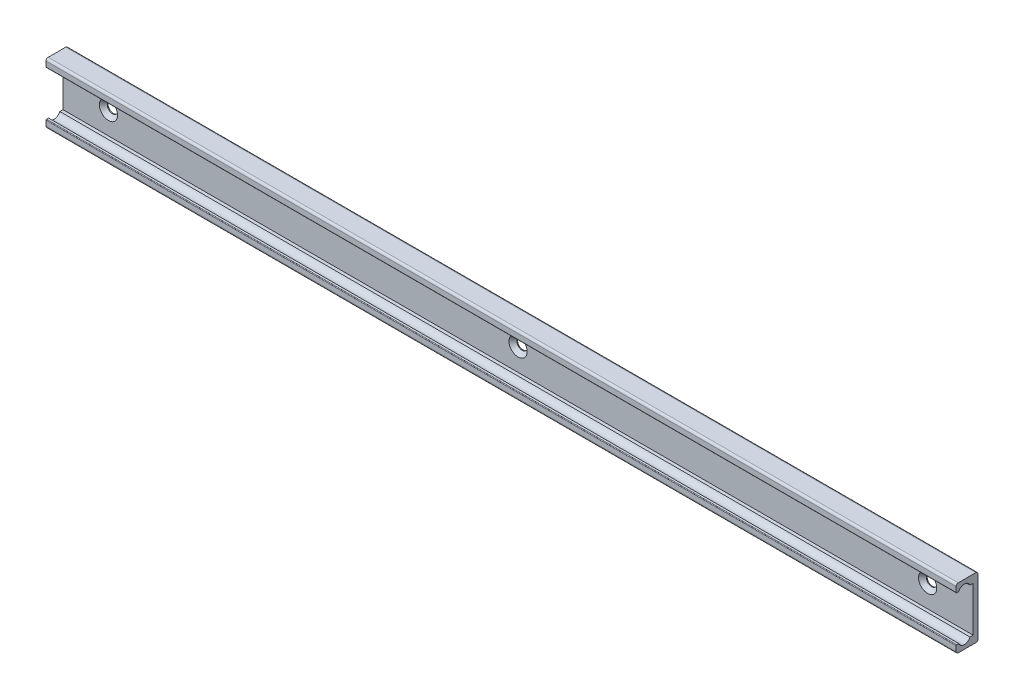
ISO-10303-21;
HEADER;
FILE_DESCRIPTION(('STEP AP214'),'2;1');
FILE_NAME('part.step','',(''),(''),'','','');
FILE_SCHEMA(('AUTOMOTIVE_DESIGN { 1 0 10303 214 1 1 1 1 }'));
ENDSEC;
DATA;
#1=APPLICATION_CONTEXT('core data for automotive mechanical design processes');
#2=APPLICATION_PROTOCOL_DEFINITION('international standard','automotive_design',2000,#1);
#3=PRODUCT_CONTEXT('',#1,'mechanical');
#4=PRODUCT('Part','Part','',(#3));
#5=PRODUCT_RELATED_PRODUCT_CATEGORY('part','',(#4));
#6=PRODUCT_DEFINITION_FORMATION('','',#4);
#7=PRODUCT_DEFINITION_CONTEXT('part definition',#1,'design');
#8=PRODUCT_DEFINITION('design','',#6,#7);
#9=PRODUCT_DEFINITION_SHAPE('','',#8);
#10=(LENGTH_UNIT() NAMED_UNIT(*) SI_UNIT(.MILLI.,.METRE.));
#11=(NAMED_UNIT(*) PLANE_ANGLE_UNIT() SI_UNIT($,.RADIAN.));
#12=(NAMED_UNIT(*) SI_UNIT($,.STERADIAN.) SOLID_ANGLE_UNIT());
#13=UNCERTAINTY_MEASURE_WITH_UNIT(LENGTH_MEASURE(1.E-05),#10,'distance_accuracy_value','');
#14=(GEOMETRIC_REPRESENTATION_CONTEXT(3) GLOBAL_UNCERTAINTY_ASSIGNED_CONTEXT((#13)) GLOBAL_UNIT_ASSIGNED_CONTEXT((#10,
#11,#12)) REPRESENTATION_CONTEXT('',''));
#15=CARTESIAN_POINT('',(0.,0.,0.));
#16=DIRECTION('',(0.,0.,1.));
#17=DIRECTION('',(1.,0.,0.));
#18=AXIS2_PLACEMENT_3D('',#15,#16,#17);
#19=CARTESIAN_POINT('',(285.,9.3,6.49999999999987));
#20=DIRECTION('',(-1.,0.,0.));
#21=DIRECTION('',(0.,0.,1.));
#22=AXIS2_PLACEMENT_3D('',#19,#20,#21);
#23=CYLINDRICAL_SURFACE('',#22,0.7);
#24=CARTESIAN_POINT('',(-15.,9.3,6.49999999999987));
#25=DIRECTION('',(-1.,0.,0.));
#26=DIRECTION('',(0.,0.,-1.));
#27=AXIS2_PLACEMENT_3D('',#24,#25,#26);
#28=CIRCLE('',#27,0.7);
#29=CARTESIAN_POINT('',(-15.,9.3,7.19999999999987));
#30=VERTEX_POINT('',#29);
#31=CARTESIAN_POINT('',(-15.,10.,6.49999999999987));
#32=VERTEX_POINT('',#31);
#33=EDGE_CURVE('E141',#30,#32,#28,.T.);
#34=ORIENTED_EDGE('',*,*,#33,.F.);
#35=DIRECTION('',(-1.,0.,0.));
#36=VECTOR('',#35,1.);
#37=CARTESIAN_POINT('',(285.,9.3,7.19999999999987));
#38=LINE('',#37,#36);
#39=CARTESIAN_POINT('',(285.,9.3,7.19999999999987));
#40=VERTEX_POINT('',#39);
#41=EDGE_CURVE('E11',#40,#30,#38,.T.);
#42=ORIENTED_EDGE('',*,*,#41,.F.);
#43=CARTESIAN_POINT('',(285.,9.3,6.49999999999987));
#44=DIRECTION('',(-1.,0.,0.));
#45=DIRECTION('',(0.,0.,-1.));
#46=AXIS2_PLACEMENT_3D('',#43,#44,#45);
#47=CIRCLE('',#46,0.7);
#48=CARTESIAN_POINT('',(285.,10.,6.49999999999987));
#49=VERTEX_POINT('',#48);
#50=EDGE_CURVE('E143',#40,#49,#47,.T.);
#51=ORIENTED_EDGE('',*,*,#50,.T.);
#52=DIRECTION('',(-1.,0.,0.));
#53=VECTOR('',#52,1.);
#54=CARTESIAN_POINT('',(285.,10.,6.49999999999987));
#55=LINE('',#54,#53);
#56=EDGE_CURVE('E138',#49,#32,#55,.T.);
#57=ORIENTED_EDGE('',*,*,#56,.T.);
#58=EDGE_LOOP('',(#34,#42,#51,#57));
#59=FACE_BOUND('',#58,.T.);
#60=ADVANCED_FACE('F16',(#59),#23,.T.);
#61=CARTESIAN_POINT('',(285.,7.60000008647907,7.19999999999987));
#62=DIRECTION('',(0.,0.,1.));
#63=DIRECTION('',(1.,0.,0.));
#64=AXIS2_PLACEMENT_3D('',#61,#62,#63);
#65=PLANE('',#64);
#66=DIRECTION('',(0.,1.,0.));
#67=VECTOR('',#66,1.);
#68=CARTESIAN_POINT('',(-15.,7.60000008647907,7.19999999999987));
#69=LINE('',#68,#67);
#70=CARTESIAN_POINT('',(-15.,7.60000008647907,7.19999999999987));
#71=VERTEX_POINT('',#70);
#72=EDGE_CURVE('E160',#71,#30,#69,.T.);
#73=ORIENTED_EDGE('',*,*,#72,.F.);
#74=DIRECTION('',(-1.,0.,0.));
#75=VECTOR('',#74,1.);
#76=CARTESIAN_POINT('',(285.,7.60000008647907,7.19999999999987));
#77=LINE('',#76,#75);
#78=CARTESIAN_POINT('',(285.,7.60000008647907,7.19999999999987));
#79=VERTEX_POINT('',#78);
#80=EDGE_CURVE('E24',#79,#71,#77,.T.);
#81=ORIENTED_EDGE('',*,*,#80,.F.);
#82=DIRECTION('',(0.,1.,0.));
#83=VECTOR('',#82,1.);
#84=CARTESIAN_POINT('',(285.,7.60000008647907,7.19999999999987));
#85=LINE('',#84,#83);
#86=EDGE_CURVE('E148',#79,#40,#85,.T.);
#87=ORIENTED_EDGE('',*,*,#86,.T.);
#88=ORIENTED_EDGE('',*,*,#41,.T.);
#89=EDGE_LOOP('',(#73,#81,#87,#88));
#90=FACE_BOUND('',#89,.T.);
#91=ADVANCED_FACE('F387',(#90),#65,.T.);
#92=CARTESIAN_POINT('',(285.,7.60000008647906,6.99999999999987));
#93=DIRECTION('',(-1.,0.,0.));
#94=DIRECTION('',(0.,0.,1.));
#95=AXIS2_PLACEMENT_3D('',#92,#93,#94);
#96=CYLINDRICAL_SURFACE('',#95,0.2);
#97=CARTESIAN_POINT('',(-15.,7.60000008647906,6.99999999999987));
#98=DIRECTION('',(-1.,0.,0.));
#99=DIRECTION('',(0.,0.,-1.));
#100=AXIS2_PLACEMENT_3D('',#97,#98,#99);
#101=CIRCLE('',#100,0.2);
#102=CARTESIAN_POINT('',(-15.,7.40000008647906,6.99999999999987));
#103=VERTEX_POINT('',#102);
#104=EDGE_CURVE('E208',#103,#71,#101,.T.);
#105=ORIENTED_EDGE('',*,*,#104,.F.);
#106=DIRECTION('',(-1.,0.,0.));
#107=VECTOR('',#106,1.);
#108=CARTESIAN_POINT('',(285.,7.40000008647906,6.99999999999987));
#109=LINE('',#108,#107);
#110=CARTESIAN_POINT('',(285.,7.40000008647906,6.99999999999987));
#111=VERTEX_POINT('',#110);
#112=EDGE_CURVE('E260',#111,#103,#109,.T.);
#113=ORIENTED_EDGE('',*,*,#112,.F.);
#114=CARTESIAN_POINT('',(285.,7.60000008647906,6.99999999999987));
#115=DIRECTION('',(-1.,0.,0.));
#116=DIRECTION('',(0.,0.,-1.));
#117=AXIS2_PLACEMENT_3D('',#114,#115,#116);
#118=CIRCLE('',#117,0.2);
#119=EDGE_CURVE('E256',#111,#79,#118,.T.);
#120=ORIENTED_EDGE('',*,*,#119,.T.);
#121=ORIENTED_EDGE('',*,*,#80,.T.);
#122=EDGE_LOOP('',(#105,#113,#120,#121));
#123=FACE_BOUND('',#122,.T.);
#124=ADVANCED_FACE('F391',(#123),#96,.T.);
#125=CARTESIAN_POINT('',(285.,7.40000008647906,6.35404949999996));
#126=DIRECTION('',(0.,-1.,0.));
#127=DIRECTION('',(1.,0.,0.));
#128=AXIS2_PLACEMENT_3D('',#125,#126,#127);
#129=PLANE('',#128);
#130=DIRECTION('',(0.,0.,1.));
#131=VECTOR('',#130,1.);
#132=CARTESIAN_POINT('',(-15.,7.40000008647906,6.35404949999996));
#133=LINE('',#132,#131);
#134=CARTESIAN_POINT('',(-15.,7.40000008647906,6.35404949999996));
#135=VERTEX_POINT('',#134);
#136=EDGE_CURVE('E205',#135,#103,#133,.T.);
#137=ORIENTED_EDGE('',*,*,#136,.F.);
#138=DIRECTION('',(-1.,0.,0.));
#139=VECTOR('',#138,1.);
#140=CARTESIAN_POINT('',(285.,7.40000008647906,6.35404949999996));
#141=LINE('',#140,#139);
#142=CARTESIAN_POINT('',(285.,7.40000008647906,6.35404949999996));
#143=VERTEX_POINT('',#142);
#144=EDGE_CURVE('E262',#143,#135,#141,.T.);
#145=ORIENTED_EDGE('',*,*,#144,.F.);
#146=DIRECTION('',(0.,0.,1.));
#147=VECTOR('',#146,1.);
#148=CARTESIAN_POINT('',(285.,7.40000008647906,6.35404949999996));
#149=LINE('',#148,#147);
#150=EDGE_CURVE('E253',#143,#111,#149,.T.);
#151=ORIENTED_EDGE('',*,*,#150,.T.);
#152=ORIENTED_EDGE('',*,*,#112,.T.);
#153=EDGE_LOOP('',(#137,#145,#151,#152));
#154=FACE_BOUND('',#153,.T.);
#155=ADVANCED_FACE('F396',(#154),#129,.T.);
#156=CARTESIAN_POINT('',(285.,6.65000008647909,4.50000000000006));
#157=DIRECTION('',(-1.,0.,0.));
#158=DIRECTION('',(0.,0.,1.));
#159=AXIS2_PLACEMENT_3D('',#156,#157,#158);
#160=CYLINDRICAL_SURFACE('',#159,1.99999988711246);
#161=CARTESIAN_POINT('',(-15.,6.65000008647909,4.50000000000006));
#162=DIRECTION('',(1.,0.,0.));
#163=DIRECTION('',(0.,0.,1.));
#164=AXIS2_PLACEMENT_3D('',#161,#162,#163);
#165=CIRCLE('',#164,1.99999988711246);
#166=CARTESIAN_POINT('',(-15.,7.40000008647906,2.64595050000016));
#167=VERTEX_POINT('',#166);
#168=EDGE_CURVE('E202',#167,#135,#165,.T.);
#169=ORIENTED_EDGE('',*,*,#168,.F.);
#170=DIRECTION('',(-1.,0.,0.));
#171=VECTOR('',#170,1.);
#172=CARTESIAN_POINT('',(285.,7.40000008647906,2.64595050000016));
#173=LINE('',#172,#171);
#174=CARTESIAN_POINT('',(285.,7.40000008647906,2.64595050000016));
#175=VERTEX_POINT('',#174);
#176=EDGE_CURVE('E264',#175,#167,#173,.T.);
#177=ORIENTED_EDGE('',*,*,#176,.F.);
#178=CARTESIAN_POINT('',(285.,6.65000008647909,4.50000000000006));
#179=DIRECTION('',(1.,0.,0.));
#180=DIRECTION('',(0.,0.,1.));
#181=AXIS2_PLACEMENT_3D('',#178,#179,#180);
#182=CIRCLE('',#181,1.99999988711246);
#183=EDGE_CURVE('E250',#175,#143,#182,.T.);
#184=ORIENTED_EDGE('',*,*,#183,.T.);
#185=ORIENTED_EDGE('',*,*,#144,.T.);
#186=EDGE_LOOP('',(#169,#177,#184,#185));
#187=FACE_BOUND('',#186,.T.);
#188=ADVANCED_FACE('F404',(#187),#160,.F.);
#189=CARTESIAN_POINT('',(285.,7.40000008647906,1.60000000000016));
#190=DIRECTION('',(0.,-1.,0.));
#191=DIRECTION('',(1.,0.,0.));
#192=AXIS2_PLACEMENT_3D('',#189,#190,#191);
#193=PLANE('',#192);
#194=DIRECTION('',(0.,0.,1.));
#195=VECTOR('',#194,1.);
#196=CARTESIAN_POINT('',(-15.,7.40000008647906,1.60000000000015));
#197=LINE('',#196,#195);
#198=CARTESIAN_POINT('',(-15.,7.40000008647906,1.60000000000015));
#199=VERTEX_POINT('',#198);
#200=EDGE_CURVE('E199',#199,#167,#197,.T.);
#201=ORIENTED_EDGE('',*,*,#200,.F.);
#202=DIRECTION('',(-1.,0.,0.));
#203=VECTOR('',#202,1.);
#204=CARTESIAN_POINT('',(285.,7.40000008647906,1.60000000000016));
#205=LINE('',#204,#203);
#206=CARTESIAN_POINT('',(285.,7.40000008647906,1.60000000000016));
#207=VERTEX_POINT('',#206);
#208=EDGE_CURVE('E266',#207,#199,#205,.T.);
#209=ORIENTED_EDGE('',*,*,#208,.F.);
#210=DIRECTION('',(0.,0.,1.));
#211=VECTOR('',#210,1.);
#212=CARTESIAN_POINT('',(285.,7.40000008647906,1.60000000000016));
#213=LINE('',#212,#211);
#214=EDGE_CURVE('E247',#207,#175,#213,.T.);
#215=ORIENTED_EDGE('',*,*,#214,.T.);
#216=ORIENTED_EDGE('',*,*,#176,.T.);
#217=EDGE_LOOP('',(#201,#209,#215,#216));
#218=FACE_BOUND('',#217,.T.);
#219=ADVANCED_FACE('F332',(#218),#193,.T.);
#220=CARTESIAN_POINT('',(285.,-7.40000008647906,1.60000000000016));
#221=DIRECTION('',(0.,0.,1.));
#222=DIRECTION('',(0.,1.,0.));
#223=AXIS2_PLACEMENT_3D('',#220,#221,#222);
#224=PLANE('',#223);
#225=CARTESIAN_POINT('',(270.,0.,1.60000000000016));
#226=DIRECTION('',(0.,0.,1.));
#227=DIRECTION('',(0.,1.,0.));
#228=AXIS2_PLACEMENT_3D('',#225,#226,#227);
#229=CIRCLE('',#228,3.);
#230=CARTESIAN_POINT('',(270.,3.,1.60000000000016));
#231=VERTEX_POINT('',#230);
#232=EDGE_CURVE('E293',#231,#231,#229,.T.);
#233=ORIENTED_EDGE('',*,*,#232,.F.);
#234=EDGE_LOOP('',(#233));
#235=FACE_BOUND('',#234,.T.);
#236=CARTESIAN_POINT('',(135.,0.,1.60000000000016));
#237=DIRECTION('',(0.,0.,1.));
#238=DIRECTION('',(0.,1.,0.));
#239=AXIS2_PLACEMENT_3D('',#236,#237,#238);
#240=CIRCLE('',#239,3.);
#241=CARTESIAN_POINT('',(135.,3.,1.60000000000016));
#242=VERTEX_POINT('',#241);
#243=EDGE_CURVE('E298',#242,#242,#240,.T.);
#244=ORIENTED_EDGE('',*,*,#243,.F.);
#245=EDGE_LOOP('',(#244));
#246=FACE_BOUND('',#245,.T.);
#247=CARTESIAN_POINT('',(0.,0.,1.60000000000016));
#248=DIRECTION('',(0.,0.,1.));
#249=DIRECTION('',(0.,1.,0.));
#250=AXIS2_PLACEMENT_3D('',#247,#248,#249);
#251=CIRCLE('',#250,3.);
#252=CARTESIAN_POINT('',(0.,3.,1.60000000000016));
#253=VERTEX_POINT('',#252);
#254=EDGE_CURVE('E161',#253,#253,#251,.T.);
#255=ORIENTED_EDGE('',*,*,#254,.F.);
#256=EDGE_LOOP('',(#255));
#257=FACE_BOUND('',#256,.T.);
#258=DIRECTION('',(0.,1.,0.));
#259=VECTOR('',#258,1.);
#260=CARTESIAN_POINT('',(-15.,-7.40000008647906,1.60000000000016));
#261=LINE('',#260,#259);
#262=CARTESIAN_POINT('',(-15.,-7.40000008647906,1.60000000000016));
#263=VERTEX_POINT('',#262);
#264=EDGE_CURVE('E196',#263,#199,#261,.T.);
#265=ORIENTED_EDGE('',*,*,#264,.F.);
#266=DIRECTION('',(-1.,0.,0.));
#267=VECTOR('',#266,1.);
#268=CARTESIAN_POINT('',(285.,-7.40000008647906,1.60000000000016));
#269=LINE('',#268,#267);
#270=CARTESIAN_POINT('',(285.,-7.40000008647906,1.60000000000016));
#271=VERTEX_POINT('',#270);
#272=EDGE_CURVE('E268',#271,#263,#269,.T.);
#273=ORIENTED_EDGE('',*,*,#272,.F.);
#274=DIRECTION('',(0.,1.,0.));
#275=VECTOR('',#274,1.);
#276=CARTESIAN_POINT('',(285.,-7.40000008647906,1.60000000000016));
#277=LINE('',#276,#275);
#278=EDGE_CURVE('E244',#271,#207,#277,.T.);
#279=ORIENTED_EDGE('',*,*,#278,.T.);
#280=ORIENTED_EDGE('',*,*,#208,.T.);
#281=EDGE_LOOP('',(#265,#273,#279,#280));
#282=FACE_BOUND('',#281,.T.);
#283=ADVANCED_FACE('F328',(#235,#246,#257,#282),#224,.T.);
#284=CARTESIAN_POINT('',(285.,-7.40000008647906,1.60000000000016));
#285=DIRECTION('',(0.,1.,0.));
#286=DIRECTION('',(-1.,0.,0.));
#287=AXIS2_PLACEMENT_3D('',#284,#285,#286);
#288=PLANE('',#287);
#289=DIRECTION('',(0.,0.,-1.));
#290=VECTOR('',#289,1.);
#291=CARTESIAN_POINT('',(-15.,-7.40000008647906,1.60000000000016));
#292=LINE('',#291,#290);
#293=CARTESIAN_POINT('',(-15.,-7.40000008647907,2.64595050000016));
#294=VERTEX_POINT('',#293);
#295=EDGE_CURVE('E193',#294,#263,#292,.T.);
#296=ORIENTED_EDGE('',*,*,#295,.F.);
#297=DIRECTION('',(-1.,0.,0.));
#298=VECTOR('',#297,1.);
#299=CARTESIAN_POINT('',(285.,-7.40000008647907,2.64595050000016));
#300=LINE('',#299,#298);
#301=CARTESIAN_POINT('',(285.,-7.40000008647907,2.64595050000016));
#302=VERTEX_POINT('',#301);
#303=EDGE_CURVE('E270',#302,#294,#300,.T.);
#304=ORIENTED_EDGE('',*,*,#303,.F.);
#305=DIRECTION('',(0.,0.,-1.));
#306=VECTOR('',#305,1.);
#307=CARTESIAN_POINT('',(285.,-7.40000008647906,1.60000000000016));
#308=LINE('',#307,#306);
#309=EDGE_CURVE('E241',#302,#271,#308,.T.);
#310=ORIENTED_EDGE('',*,*,#309,.T.);
#311=ORIENTED_EDGE('',*,*,#272,.T.);
#312=EDGE_LOOP('',(#296,#304,#310,#311));
#313=FACE_BOUND('',#312,.T.);
#314=ADVANCED_FACE('F331',(#313),#288,.T.);
#315=CARTESIAN_POINT('',(285.,-6.65000008647909,4.50000000000006));
#316=DIRECTION('',(-1.,0.,0.));
#317=DIRECTION('',(0.,0.,1.));
#318=AXIS2_PLACEMENT_3D('',#315,#316,#317);
#319=CYLINDRICAL_SURFACE('',#318,1.99999988711246);
#320=CARTESIAN_POINT('',(-15.,-6.65000008647909,4.50000000000006));
#321=DIRECTION('',(1.,0.,0.));
#322=DIRECTION('',(0.,0.,-1.));
#323=AXIS2_PLACEMENT_3D('',#320,#321,#322);
#324=CIRCLE('',#323,1.99999988711246);
#325=CARTESIAN_POINT('',(-15.,-7.40000008647906,6.35404949999996));
#326=VERTEX_POINT('',#325);
#327=EDGE_CURVE('E190',#326,#294,#324,.T.);
#328=ORIENTED_EDGE('',*,*,#327,.F.);
#329=DIRECTION('',(-1.,0.,0.));
#330=VECTOR('',#329,1.);
#331=CARTESIAN_POINT('',(285.,-7.40000008647906,6.35404949999996));
#332=LINE('',#331,#330);
#333=CARTESIAN_POINT('',(285.,-7.40000008647906,6.35404949999996));
#334=VERTEX_POINT('',#333);
#335=EDGE_CURVE('E272',#334,#326,#332,.T.);
#336=ORIENTED_EDGE('',*,*,#335,.F.);
#337=CARTESIAN_POINT('',(285.,-6.65000008647909,4.50000000000006));
#338=DIRECTION('',(1.,0.,0.));
#339=DIRECTION('',(0.,0.,-1.));
#340=AXIS2_PLACEMENT_3D('',#337,#338,#339);
#341=CIRCLE('',#340,1.99999988711246);
#342=EDGE_CURVE('E238',#334,#302,#341,.T.);
#343=ORIENTED_EDGE('',*,*,#342,.T.);
#344=ORIENTED_EDGE('',*,*,#303,.T.);
#345=EDGE_LOOP('',(#328,#336,#343,#344));
#346=FACE_BOUND('',#345,.T.);
#347=ADVANCED_FACE('F348',(#346),#319,.F.);
#348=CARTESIAN_POINT('',(285.,-7.40000008647906,6.35404949999996));
#349=DIRECTION('',(0.,1.,0.));
#350=DIRECTION('',(-1.,0.,0.));
#351=AXIS2_PLACEMENT_3D('',#348,#349,#350);
#352=PLANE('',#351);
#353=DIRECTION('',(0.,0.,-1.));
#354=VECTOR('',#353,1.);
#355=CARTESIAN_POINT('',(-15.,-7.40000008647906,6.35404949999996));
#356=LINE('',#355,#354);
#357=CARTESIAN_POINT('',(-15.,-7.40000008647906,6.99999999999987));
#358=VERTEX_POINT('',#357);
#359=EDGE_CURVE('E187',#358,#326,#356,.T.);
#360=ORIENTED_EDGE('',*,*,#359,.F.);
#361=DIRECTION('',(-1.,0.,0.));
#362=VECTOR('',#361,1.);
#363=CARTESIAN_POINT('',(285.,-7.40000008647906,6.99999999999987));
#364=LINE('',#363,#362);
#365=CARTESIAN_POINT('',(285.,-7.40000008647906,6.99999999999987));
#366=VERTEX_POINT('',#365);
#367=EDGE_CURVE('E274',#366,#358,#364,.T.);
#368=ORIENTED_EDGE('',*,*,#367,.F.);
#369=DIRECTION('',(0.,0.,-1.));
#370=VECTOR('',#369,1.);
#371=CARTESIAN_POINT('',(285.,-7.40000008647906,6.35404949999996));
#372=LINE('',#371,#370);
#373=EDGE_CURVE('E235',#366,#334,#372,.T.);
#374=ORIENTED_EDGE('',*,*,#373,.T.);
#375=ORIENTED_EDGE('',*,*,#335,.T.);
#376=EDGE_LOOP('',(#360,#368,#374,#375));
#377=FACE_BOUND('',#376,.T.);
#378=ADVANCED_FACE('F351',(#377),#352,.T.);
#379=CARTESIAN_POINT('',(285.,-7.60000008647906,6.99999999999987));
#380=DIRECTION('',(-1.,0.,0.));
#381=DIRECTION('',(0.,0.,1.));
#382=AXIS2_PLACEMENT_3D('',#379,#380,#381);
#383=CYLINDRICAL_SURFACE('',#382,0.2);
#384=CARTESIAN_POINT('',(-15.,-7.60000008647906,6.99999999999987));
#385=DIRECTION('',(-1.,0.,0.));
#386=DIRECTION('',(0.,0.,1.));
#387=AXIS2_PLACEMENT_3D('',#384,#385,#386);
#388=CIRCLE('',#387,0.2);
#389=CARTESIAN_POINT('',(-15.,-7.60000008647907,7.19999999999987));
#390=VERTEX_POINT('',#389);
#391=EDGE_CURVE('E184',#390,#358,#388,.T.);
#392=ORIENTED_EDGE('',*,*,#391,.F.);
#393=DIRECTION('',(-1.,0.,0.));
#394=VECTOR('',#393,1.);
#395=CARTESIAN_POINT('',(285.,-7.60000008647907,7.19999999999987));
#396=LINE('',#395,#394);
#397=CARTESIAN_POINT('',(285.,-7.60000008647907,7.19999999999987));
#398=VERTEX_POINT('',#397);
#399=EDGE_CURVE('E276',#398,#390,#396,.T.);
#400=ORIENTED_EDGE('',*,*,#399,.F.);
#401=CARTESIAN_POINT('',(285.,-7.60000008647906,6.99999999999987));
#402=DIRECTION('',(-1.,0.,0.));
#403=DIRECTION('',(0.,0.,1.));
#404=AXIS2_PLACEMENT_3D('',#401,#402,#403);
#405=CIRCLE('',#404,0.2);
#406=EDGE_CURVE('E232',#398,#366,#405,.T.);
#407=ORIENTED_EDGE('',*,*,#406,.T.);
#408=ORIENTED_EDGE('',*,*,#367,.T.);
#409=EDGE_LOOP('',(#392,#400,#407,#408));
#410=FACE_BOUND('',#409,.T.);
#411=ADVANCED_FACE('F356',(#410),#383,.T.);
#412=CARTESIAN_POINT('',(285.,-7.60000008647907,7.19999999999987));
#413=DIRECTION('',(0.,0.,1.));
#414=DIRECTION('',(1.,0.,0.));
#415=AXIS2_PLACEMENT_3D('',#412,#413,#414);
#416=PLANE('',#415);
#417=DIRECTION('',(0.,1.,0.));
#418=VECTOR('',#417,1.);
#419=CARTESIAN_POINT('',(-15.,-7.60000008647907,7.19999999999987));
#420=LINE('',#419,#418);
#421=CARTESIAN_POINT('',(-15.,-9.3,7.19999999999987));
#422=VERTEX_POINT('',#421);
#423=EDGE_CURVE('E181',#422,#390,#420,.T.);
#424=ORIENTED_EDGE('',*,*,#423,.F.);
#425=DIRECTION('',(-1.,0.,0.));
#426=VECTOR('',#425,1.);
#427=CARTESIAN_POINT('',(285.,-9.3,7.19999999999987));
#428=LINE('',#427,#426);
#429=CARTESIAN_POINT('',(285.,-9.3,7.19999999999987));
#430=VERTEX_POINT('',#429);
#431=EDGE_CURVE('E278',#430,#422,#428,.T.);
#432=ORIENTED_EDGE('',*,*,#431,.F.);
#433=DIRECTION('',(0.,1.,0.));
#434=VECTOR('',#433,1.);
#435=CARTESIAN_POINT('',(285.,-7.60000008647907,7.19999999999987));
#436=LINE('',#435,#434);
#437=EDGE_CURVE('E229',#430,#398,#436,.T.);
#438=ORIENTED_EDGE('',*,*,#437,.T.);
#439=ORIENTED_EDGE('',*,*,#399,.T.);
#440=EDGE_LOOP('',(#424,#432,#438,#439));
#441=FACE_BOUND('',#440,.T.);
#442=ADVANCED_FACE('F359',(#441),#416,.T.);
#443=CARTESIAN_POINT('',(285.,-9.3,6.49999999999987));
#444=DIRECTION('',(-1.,0.,0.));
#445=DIRECTION('',(0.,0.,1.));
#446=AXIS2_PLACEMENT_3D('',#443,#444,#445);
#447=CYLINDRICAL_SURFACE('',#446,0.7);
#448=CARTESIAN_POINT('',(-15.,-9.3,6.49999999999987));
#449=DIRECTION('',(-1.,0.,0.));
#450=DIRECTION('',(0.,0.,1.));
#451=AXIS2_PLACEMENT_3D('',#448,#449,#450);
#452=CIRCLE('',#451,0.7);
#453=CARTESIAN_POINT('',(-15.,-10.,6.49999999999987));
#454=VERTEX_POINT('',#453);
#455=EDGE_CURVE('E178',#454,#422,#452,.T.);
#456=ORIENTED_EDGE('',*,*,#455,.F.);
#457=DIRECTION('',(-1.,0.,0.));
#458=VECTOR('',#457,1.);
#459=CARTESIAN_POINT('',(285.,-10.,6.49999999999987));
#460=LINE('',#459,#458);
#461=CARTESIAN_POINT('',(285.,-10.,6.49999999999987));
#462=VERTEX_POINT('',#461);
#463=EDGE_CURVE('E280',#462,#454,#460,.T.);
#464=ORIENTED_EDGE('',*,*,#463,.F.);
#465=CARTESIAN_POINT('',(285.,-9.3,6.49999999999987));
#466=DIRECTION('',(-1.,0.,0.));
#467=DIRECTION('',(0.,0.,1.));
#468=AXIS2_PLACEMENT_3D('',#465,#466,#467);
#469=CIRCLE('',#468,0.7);
#470=EDGE_CURVE('E226',#462,#430,#469,.T.);
#471=ORIENTED_EDGE('',*,*,#470,.T.);
#472=ORIENTED_EDGE('',*,*,#431,.T.);
#473=EDGE_LOOP('',(#456,#464,#471,#472));
#474=FACE_BOUND('',#473,.T.);
#475=ADVANCED_FACE('F364',(#474),#447,.T.);
#476=CARTESIAN_POINT('',(285.,-10.,0.700000000000001));
#477=DIRECTION('',(0.,-1.,0.));
#478=DIRECTION('',(1.,0.,0.));
#479=AXIS2_PLACEMENT_3D('',#476,#477,#478);
#480=PLANE('',#479);
#481=DIRECTION('',(0.,0.,1.));
#482=VECTOR('',#481,1.);
#483=CARTESIAN_POINT('',(-15.,-10.,0.700000000000001));
#484=LINE('',#483,#482);
#485=CARTESIAN_POINT('',(-15.,-10.,0.700000000000001));
#486=VERTEX_POINT('',#485);
#487=EDGE_CURVE('E175',#486,#454,#484,.T.);
#488=ORIENTED_EDGE('',*,*,#487,.F.);
#489=DIRECTION('',(-1.,0.,0.));
#490=VECTOR('',#489,1.);
#491=CARTESIAN_POINT('',(285.,-10.,0.700000000000001));
#492=LINE('',#491,#490);
#493=CARTESIAN_POINT('',(285.,-10.,0.700000000000001));
#494=VERTEX_POINT('',#493);
#495=EDGE_CURVE('E282',#494,#486,#492,.T.);
#496=ORIENTED_EDGE('',*,*,#495,.F.);
#497=DIRECTION('',(0.,0.,1.));
#498=VECTOR('',#497,1.);
#499=CARTESIAN_POINT('',(285.,-10.,0.700000000000001));
#500=LINE('',#499,#498);
#501=EDGE_CURVE('E223',#494,#462,#500,.T.);
#502=ORIENTED_EDGE('',*,*,#501,.T.);
#503=ORIENTED_EDGE('',*,*,#463,.T.);
#504=EDGE_LOOP('',(#488,#496,#502,#503));
#505=FACE_BOUND('',#504,.T.);
#506=ADVANCED_FACE('F367',(#505),#480,.T.);
#507=CARTESIAN_POINT('',(285.,-9.3,0.700000000000001));
#508=DIRECTION('',(-1.,0.,0.));
#509=DIRECTION('',(0.,0.,1.));
#510=AXIS2_PLACEMENT_3D('',#507,#508,#509);
#511=CYLINDRICAL_SURFACE('',#510,0.7);
#512=CARTESIAN_POINT('',(-15.,-9.3,0.700000000000001));
#513=DIRECTION('',(-1.,0.,0.));
#514=DIRECTION('',(0.,0.,1.));
#515=AXIS2_PLACEMENT_3D('',#512,#513,#514);
#516=CIRCLE('',#515,0.7);
#517=CARTESIAN_POINT('',(-15.,-9.3,0.));
#518=VERTEX_POINT('',#517);
#519=EDGE_CURVE('E172',#518,#486,#516,.T.);
#520=ORIENTED_EDGE('',*,*,#519,.F.);
#521=DIRECTION('',(-1.,0.,0.));
#522=VECTOR('',#521,1.);
#523=CARTESIAN_POINT('',(285.,-9.3,0.));
#524=LINE('',#523,#522);
#525=CARTESIAN_POINT('',(285.,-9.3,0.));
#526=VERTEX_POINT('',#525);
#527=EDGE_CURVE('E284',#526,#518,#524,.T.);
#528=ORIENTED_EDGE('',*,*,#527,.F.);
#529=CARTESIAN_POINT('',(285.,-9.3,0.700000000000001));
#530=DIRECTION('',(-1.,0.,0.));
#531=DIRECTION('',(0.,0.,1.));
#532=AXIS2_PLACEMENT_3D('',#529,#530,#531);
#533=CIRCLE('',#532,0.7);
#534=EDGE_CURVE('E220',#526,#494,#533,.T.);
#535=ORIENTED_EDGE('',*,*,#534,.T.);
#536=ORIENTED_EDGE('',*,*,#495,.T.);
#537=EDGE_LOOP('',(#520,#528,#535,#536));
#538=FACE_BOUND('',#537,.T.);
#539=ADVANCED_FACE('F372',(#538),#511,.T.);
#540=CARTESIAN_POINT('',(285.,-9.3,0.));
#541=DIRECTION('',(0.,0.,-1.));
#542=DIRECTION('',(-1.,0.,0.));
#543=AXIS2_PLACEMENT_3D('',#540,#541,#542);
#544=PLANE('',#543);
#545=CARTESIAN_POINT('',(270.,0.,0.));
#546=DIRECTION('',(0.,0.,1.));
#547=DIRECTION('',(0.,1.,0.));
#548=AXIS2_PLACEMENT_3D('',#545,#546,#547);
#549=CIRCLE('',#548,1.75);
#550=CARTESIAN_POINT('',(270.,1.75,0.));
#551=VERTEX_POINT('',#550);
#552=EDGE_CURVE('E305',#551,#551,#549,.T.);
#553=ORIENTED_EDGE('',*,*,#552,.T.);
#554=EDGE_LOOP('',(#553));
#555=FACE_BOUND('',#554,.T.);
#556=CARTESIAN_POINT('',(135.,0.,0.));
#557=DIRECTION('',(0.,0.,1.));
#558=DIRECTION('',(0.,1.,0.));
#559=AXIS2_PLACEMENT_3D('',#556,#557,#558);
#560=CIRCLE('',#559,1.75);
#561=CARTESIAN_POINT('',(135.,1.75,0.));
#562=VERTEX_POINT('',#561);
#563=EDGE_CURVE('E294',#562,#562,#560,.T.);
#564=ORIENTED_EDGE('',*,*,#563,.T.);
#565=EDGE_LOOP('',(#564));
#566=FACE_BOUND('',#565,.T.);
#567=CARTESIAN_POINT('',(0.,0.,0.));
#568=DIRECTION('',(0.,0.,1.));
#569=DIRECTION('',(0.,1.,0.));
#570=AXIS2_PLACEMENT_3D('',#567,#568,#569);
#571=CIRCLE('',#570,1.75);
#572=CARTESIAN_POINT('',(0.,1.75,0.));
#573=VERTEX_POINT('',#572);
#574=EDGE_CURVE('E290',#573,#573,#571,.T.);
#575=ORIENTED_EDGE('',*,*,#574,.T.);
#576=EDGE_LOOP('',(#575));
#577=FACE_BOUND('',#576,.T.);
#578=DIRECTION('',(0.,-1.,0.));
#579=VECTOR('',#578,1.);
#580=CARTESIAN_POINT('',(-15.,-9.3,0.));
#581=LINE('',#580,#579);
#582=CARTESIAN_POINT('',(-15.,9.3,0.));
#583=VERTEX_POINT('',#582);
#584=EDGE_CURVE('E169',#583,#518,#581,.T.);
#585=ORIENTED_EDGE('',*,*,#584,.F.);
#586=DIRECTION('',(-1.,0.,0.));
#587=VECTOR('',#586,1.);
#588=CARTESIAN_POINT('',(285.,9.3,0.));
#589=LINE('',#588,#587);
#590=CARTESIAN_POINT('',(285.,9.3,0.));
#591=VERTEX_POINT('',#590);
#592=EDGE_CURVE('E286',#591,#583,#589,.T.);
#593=ORIENTED_EDGE('',*,*,#592,.F.);
#594=DIRECTION('',(0.,-1.,0.));
#595=VECTOR('',#594,1.);
#596=CARTESIAN_POINT('',(285.,-9.3,0.));
#597=LINE('',#596,#595);
#598=EDGE_CURVE('E217',#591,#526,#597,.T.);
#599=ORIENTED_EDGE('',*,*,#598,.T.);
#600=ORIENTED_EDGE('',*,*,#527,.T.);
#601=EDGE_LOOP('',(#585,#593,#599,#600));
#602=FACE_BOUND('',#601,.T.);
#603=ADVANCED_FACE('F312',(#555,#566,#577,#602),#544,.T.);
#604=CARTESIAN_POINT('',(285.,9.3,0.699999999999999));
#605=DIRECTION('',(-1.,0.,0.));
#606=DIRECTION('',(0.,0.,1.));
#607=AXIS2_PLACEMENT_3D('',#604,#605,#606);
#608=CYLINDRICAL_SURFACE('',#607,0.7);
#609=CARTESIAN_POINT('',(-15.,9.3,0.699999999999999));
#610=DIRECTION('',(-1.,0.,0.));
#611=DIRECTION('',(0.,0.,-1.));
#612=AXIS2_PLACEMENT_3D('',#609,#610,#611);
#613=CIRCLE('',#612,0.7);
#614=CARTESIAN_POINT('',(-15.,10.,0.699999999999999));
#615=VERTEX_POINT('',#614);
#616=EDGE_CURVE('E156',#615,#583,#613,.T.);
#617=ORIENTED_EDGE('',*,*,#616,.F.);
#618=DIRECTION('',(-1.,0.,0.));
#619=VECTOR('',#618,1.);
#620=CARTESIAN_POINT('',(285.,10.,0.699999999999999));
#621=LINE('',#620,#619);
#622=CARTESIAN_POINT('',(285.,10.,0.699999999999999));
#623=VERTEX_POINT('',#622);
#624=EDGE_CURVE('E147',#623,#615,#621,.T.);
#625=ORIENTED_EDGE('',*,*,#624,.F.);
#626=CARTESIAN_POINT('',(285.,9.3,0.699999999999999));
#627=DIRECTION('',(-1.,0.,0.));
#628=DIRECTION('',(0.,0.,-1.));
#629=AXIS2_PLACEMENT_3D('',#626,#627,#628);
#630=CIRCLE('',#629,0.7);
#631=EDGE_CURVE('E214',#623,#591,#630,.T.);
#632=ORIENTED_EDGE('',*,*,#631,.T.);
#633=ORIENTED_EDGE('',*,*,#592,.T.);
#634=EDGE_LOOP('',(#617,#625,#632,#633));
#635=FACE_BOUND('',#634,.T.);
#636=ADVANCED_FACE('F376',(#635),#608,.T.);
#637=CARTESIAN_POINT('',(285.,10.,0.699999999999999));
#638=DIRECTION('',(0.,1.,0.));
#639=DIRECTION('',(-1.,0.,0.));
#640=AXIS2_PLACEMENT_3D('',#637,#638,#639);
#641=PLANE('',#640);
#642=DIRECTION('',(0.,0.,-1.));
#643=VECTOR('',#642,1.);
#644=CARTESIAN_POINT('',(-15.,10.,0.699999999999999));
#645=LINE('',#644,#643);
#646=EDGE_CURVE('E151',#32,#615,#645,.T.);
#647=ORIENTED_EDGE('',*,*,#646,.F.);
#648=ORIENTED_EDGE('',*,*,#56,.F.);
#649=DIRECTION('',(0.,0.,-1.));
#650=VECTOR('',#649,1.);
#651=CARTESIAN_POINT('',(285.,10.,0.699999999999999));
#652=LINE('',#651,#650);
#653=EDGE_CURVE('E212',#49,#623,#652,.T.);
#654=ORIENTED_EDGE('',*,*,#653,.T.);
#655=ORIENTED_EDGE('',*,*,#624,.T.);
#656=EDGE_LOOP('',(#647,#648,#654,#655));
#657=FACE_BOUND('',#656,.T.);
#658=ADVANCED_FACE('F152',(#657),#641,.T.);
#659=CARTESIAN_POINT('',(285.,9.3,6.49999999999987));
#660=DIRECTION('',(1.,0.,0.));
#661=DIRECTION('',(0.,0.,-1.));
#662=AXIS2_PLACEMENT_3D('',#659,#660,#661);
#663=PLANE('',#662);
#664=ORIENTED_EDGE('',*,*,#50,.F.);
#665=ORIENTED_EDGE('',*,*,#86,.F.);
#666=ORIENTED_EDGE('',*,*,#119,.F.);
#667=ORIENTED_EDGE('',*,*,#150,.F.);
#668=ORIENTED_EDGE('',*,*,#183,.F.);
#669=ORIENTED_EDGE('',*,*,#214,.F.);
#670=ORIENTED_EDGE('',*,*,#278,.F.);
#671=ORIENTED_EDGE('',*,*,#309,.F.);
#672=ORIENTED_EDGE('',*,*,#342,.F.);
#673=ORIENTED_EDGE('',*,*,#373,.F.);
#674=ORIENTED_EDGE('',*,*,#406,.F.);
#675=ORIENTED_EDGE('',*,*,#437,.F.);
#676=ORIENTED_EDGE('',*,*,#470,.F.);
#677=ORIENTED_EDGE('',*,*,#501,.F.);
#678=ORIENTED_EDGE('',*,*,#534,.F.);
#679=ORIENTED_EDGE('',*,*,#598,.F.);
#680=ORIENTED_EDGE('',*,*,#631,.F.);
#681=ORIENTED_EDGE('',*,*,#653,.F.);
#682=EDGE_LOOP('',(#664,#665,#666,#667,#668,#669,#670,#671,#672,#673,#674,#675,#676,#677,#678,
#679,#680,#681));
#683=FACE_BOUND('',#682,.T.);
#684=ADVANCED_FACE('F344',(#683),#663,.T.);
#685=CARTESIAN_POINT('',(-15.,9.3,6.49999999999987));
#686=DIRECTION('',(1.,0.,0.));
#687=DIRECTION('',(0.,0.,-1.));
#688=AXIS2_PLACEMENT_3D('',#685,#686,#687);
#689=PLANE('',#688);
#690=ORIENTED_EDGE('',*,*,#33,.T.);
#691=ORIENTED_EDGE('',*,*,#646,.T.);
#692=ORIENTED_EDGE('',*,*,#616,.T.);
#693=ORIENTED_EDGE('',*,*,#584,.T.);
#694=ORIENTED_EDGE('',*,*,#519,.T.);
#695=ORIENTED_EDGE('',*,*,#487,.T.);
#696=ORIENTED_EDGE('',*,*,#455,.T.);
#697=ORIENTED_EDGE('',*,*,#423,.T.);
#698=ORIENTED_EDGE('',*,*,#391,.T.);
#699=ORIENTED_EDGE('',*,*,#359,.T.);
#700=ORIENTED_EDGE('',*,*,#327,.T.);
#701=ORIENTED_EDGE('',*,*,#295,.T.);
#702=ORIENTED_EDGE('',*,*,#264,.T.);
#703=ORIENTED_EDGE('',*,*,#200,.T.);
#704=ORIENTED_EDGE('',*,*,#168,.T.);
#705=ORIENTED_EDGE('',*,*,#136,.T.);
#706=ORIENTED_EDGE('',*,*,#104,.T.);
#707=ORIENTED_EDGE('',*,*,#72,.T.);
#708=EDGE_LOOP('',(#690,#691,#692,#693,#694,#695,#696,#697,#698,#699,#700,#701,#702,#703,#704,
#705,#706,#707));
#709=FACE_BOUND('',#708,.T.);
#710=ADVANCED_FACE('F158',(#709),#689,.F.);
#711=CARTESIAN_POINT('',(0.,0.,1.60000000000016));
#712=DIRECTION('',(0.,0.,1.));
#713=DIRECTION('',(0.,1.,0.));
#714=AXIS2_PLACEMENT_3D('',#711,#712,#713);
#715=CONICAL_SURFACE('',#714,3.,0.750491578357564);
#716=CARTESIAN_POINT('',(0.,0.,0.259539112469308));
#717=DIRECTION('',(0.,0.,1.));
#718=DIRECTION('',(0.,1.,0.));
#719=AXIS2_PLACEMENT_3D('',#716,#717,#718);
#720=CIRCLE('',#719,1.75);
#721=CARTESIAN_POINT('',(0.,1.75,0.259539112469308));
#722=VERTEX_POINT('',#721);
#723=EDGE_CURVE('E164',#722,#722,#720,.F.);
#724=ORIENTED_EDGE('',*,*,#723,.T.);
#725=EDGE_LOOP('',(#724));
#726=FACE_BOUND('',#725,.T.);
#727=ORIENTED_EDGE('',*,*,#254,.T.);
#728=EDGE_LOOP('',(#727));
#729=FACE_BOUND('',#728,.T.);
#730=ADVANCED_FACE('F319',(#726,#729),#715,.F.);
#731=CARTESIAN_POINT('',(0.,0.,0.));
#732=DIRECTION('',(0.,0.,1.));
#733=DIRECTION('',(0.,1.,0.));
#734=AXIS2_PLACEMENT_3D('',#731,#732,#733);
#735=CYLINDRICAL_SURFACE('',#734,1.75);
#736=ORIENTED_EDGE('',*,*,#574,.F.);
#737=EDGE_LOOP('',(#736));
#738=FACE_BOUND('',#737,.T.);
#739=ORIENTED_EDGE('',*,*,#723,.F.);
#740=EDGE_LOOP('',(#739));
#741=FACE_BOUND('',#740,.T.);
#742=ADVANCED_FACE('F315',(#738,#741),#735,.F.);
#743=CARTESIAN_POINT('',(135.,0.,1.60000000000016));
#744=DIRECTION('',(0.,0.,1.));
#745=DIRECTION('',(0.,1.,0.));
#746=AXIS2_PLACEMENT_3D('',#743,#744,#745);
#747=CONICAL_SURFACE('',#746,3.,0.750491578357564);
#748=CARTESIAN_POINT('',(135.,0.,0.259539112469297));
#749=DIRECTION('',(0.,0.,1.));
#750=DIRECTION('',(0.,1.,0.));
#751=AXIS2_PLACEMENT_3D('',#748,#749,#750);
#752=CIRCLE('',#751,1.75);
#753=CARTESIAN_POINT('',(135.,1.75,0.259539112469297));
#754=VERTEX_POINT('',#753);
#755=EDGE_CURVE('E291',#754,#754,#752,.F.);
#756=ORIENTED_EDGE('',*,*,#755,.T.);
#757=EDGE_LOOP('',(#756));
#758=FACE_BOUND('',#757,.T.);
#759=ORIENTED_EDGE('',*,*,#243,.T.);
#760=EDGE_LOOP('',(#759));
#761=FACE_BOUND('',#760,.T.);
#762=ADVANCED_FACE('F318',(#758,#761),#747,.F.);
#763=CARTESIAN_POINT('',(270.,0.,1.60000000000016));
#764=DIRECTION('',(0.,0.,1.));
#765=DIRECTION('',(0.,1.,0.));
#766=AXIS2_PLACEMENT_3D('',#763,#764,#765);
#767=CONICAL_SURFACE('',#766,3.,0.750491578357564);
#768=CARTESIAN_POINT('',(270.,0.,0.259539112469308));
#769=DIRECTION('',(0.,0.,1.));
#770=DIRECTION('',(0.,1.,0.));
#771=AXIS2_PLACEMENT_3D('',#768,#769,#770);
#772=CIRCLE('',#771,1.75);
#773=CARTESIAN_POINT('',(270.,1.75,0.259539112469308));
#774=VERTEX_POINT('',#773);
#775=EDGE_CURVE('E19',#774,#774,#772,.F.);
#776=ORIENTED_EDGE('',*,*,#775,.T.);
#777=EDGE_LOOP('',(#776));
#778=FACE_BOUND('',#777,.T.);
#779=ORIENTED_EDGE('',*,*,#232,.T.);
#780=EDGE_LOOP('',(#779));
#781=FACE_BOUND('',#780,.T.);
#782=ADVANCED_FACE('F485',(#778,#781),#767,.F.);
#783=CARTESIAN_POINT('',(135.,0.,0.));
#784=DIRECTION('',(0.,0.,1.));
#785=DIRECTION('',(0.,1.,0.));
#786=AXIS2_PLACEMENT_3D('',#783,#784,#785);
#787=CYLINDRICAL_SURFACE('',#786,1.75);
#788=ORIENTED_EDGE('',*,*,#563,.F.);
#789=EDGE_LOOP('',(#788));
#790=FACE_BOUND('',#789,.T.);
#791=ORIENTED_EDGE('',*,*,#755,.F.);
#792=EDGE_LOOP('',(#791));
#793=FACE_BOUND('',#792,.T.);
#794=ADVANCED_FACE('F494',(#790,#793),#787,.F.);
#795=CARTESIAN_POINT('',(270.,0.,0.));
#796=DIRECTION('',(0.,0.,1.));
#797=DIRECTION('',(0.,1.,0.));
#798=AXIS2_PLACEMENT_3D('',#795,#796,#797);
#799=CYLINDRICAL_SURFACE('',#798,1.75);
#800=ORIENTED_EDGE('',*,*,#552,.F.);
#801=EDGE_LOOP('',(#800));
#802=FACE_BOUND('',#801,.T.);
#803=ORIENTED_EDGE('',*,*,#775,.F.);
#804=EDGE_LOOP('',(#803));
#805=FACE_BOUND('',#804,.T.);
#806=ADVANCED_FACE('F504',(#802,#805),#799,.F.);
#807=CLOSED_SHELL('',(#60,#91,#124,#155,#188,#219,#283,#314,#347,#378,#411,#442,#475,#506,#539,
#603,#636,#658,#684,#710,#730,#742,#762,#782,#794,#806));
#808=MANIFOLD_SOLID_BREP('B1',#807);
#809=ADVANCED_BREP_SHAPE_REPRESENTATION('',(#18,#808),#14);
#810=SHAPE_DEFINITION_REPRESENTATION(#9,#809);
ENDSEC;
END-ISO-10303-21;
